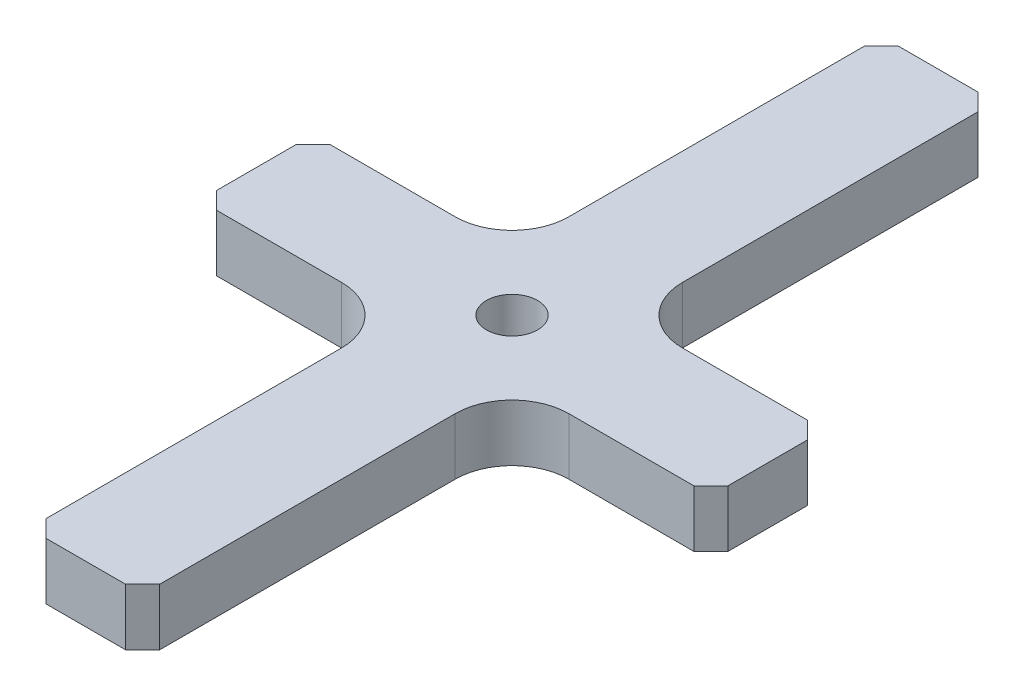
ISO-10303-21;
HEADER;
FILE_DESCRIPTION(('STEP AP214'),'2;1');
FILE_NAME('part.step','',(''),(''),'','','');
FILE_SCHEMA(('AUTOMOTIVE_DESIGN { 1 0 10303 214 1 1 1 1 }'));
ENDSEC;
DATA;
#1=APPLICATION_CONTEXT('core data for automotive mechanical design processes');
#2=APPLICATION_PROTOCOL_DEFINITION('international standard','automotive_design',2000,#1);
#3=PRODUCT_CONTEXT('',#1,'mechanical');
#4=PRODUCT('Part','Part','',(#3));
#5=PRODUCT_RELATED_PRODUCT_CATEGORY('part','',(#4));
#6=PRODUCT_DEFINITION_FORMATION('','',#4);
#7=PRODUCT_DEFINITION_CONTEXT('part definition',#1,'design');
#8=PRODUCT_DEFINITION('design','',#6,#7);
#9=PRODUCT_DEFINITION_SHAPE('','',#8);
#10=(LENGTH_UNIT() NAMED_UNIT(*) SI_UNIT(.MILLI.,.METRE.));
#11=(NAMED_UNIT(*) PLANE_ANGLE_UNIT() SI_UNIT($,.RADIAN.));
#12=(NAMED_UNIT(*) SI_UNIT($,.STERADIAN.) SOLID_ANGLE_UNIT());
#13=UNCERTAINTY_MEASURE_WITH_UNIT(LENGTH_MEASURE(1.E-05),#10,'distance_accuracy_value','');
#14=(GEOMETRIC_REPRESENTATION_CONTEXT(3) GLOBAL_UNCERTAINTY_ASSIGNED_CONTEXT((#13)) GLOBAL_UNIT_ASSIGNED_CONTEXT((#10,
#11,#12)) REPRESENTATION_CONTEXT('',''));
#15=CARTESIAN_POINT('',(0.,0.,0.));
#16=DIRECTION('',(0.,0.,1.));
#17=DIRECTION('',(1.,0.,0.));
#18=AXIS2_PLACEMENT_3D('',#15,#16,#17);
#19=CARTESIAN_POINT('',(22.5,2.5,-4.99999999999999));
#20=DIRECTION('',(0.,0.,1.));
#21=DIRECTION('',(1.,0.,0.));
#22=AXIS2_PLACEMENT_3D('',#19,#20,#21);
#23=PLANE('',#22);
#24=DIRECTION('',(-1.,0.,0.));
#25=VECTOR('',#24,1.);
#26=CARTESIAN_POINT('',(22.5,2.5,-4.99999999999999));
#27=LINE('',#26,#25);
#28=CARTESIAN_POINT('',(21.,2.5,-4.99999999999999));
#29=VERTEX_POINT('',#28);
#30=CARTESIAN_POINT('',(10.,2.5,-5.));
#31=VERTEX_POINT('',#30);
#32=EDGE_CURVE('E271',#29,#31,#27,.T.);
#33=ORIENTED_EDGE('',*,*,#32,.F.);
#34=DIRECTION('',(0.,-1.,0.));
#35=VECTOR('',#34,1.);
#36=CARTESIAN_POINT('',(21.,2.5,-4.99999999999999));
#37=LINE('',#36,#35);
#38=CARTESIAN_POINT('',(21.,-2.5,-4.99999999999999));
#39=VERTEX_POINT('',#38);
#40=EDGE_CURVE('E395',#29,#39,#37,.T.);
#41=ORIENTED_EDGE('',*,*,#40,.T.);
#42=DIRECTION('',(-1.,0.,0.));
#43=VECTOR('',#42,1.);
#44=CARTESIAN_POINT('',(22.5,-2.5,-4.99999999999999));
#45=LINE('',#44,#43);
#46=CARTESIAN_POINT('',(10.,-2.5,-5.));
#47=VERTEX_POINT('',#46);
#48=EDGE_CURVE('E458',#39,#47,#45,.T.);
#49=ORIENTED_EDGE('',*,*,#48,.T.);
#50=DIRECTION('',(0.,-1.,0.));
#51=VECTOR('',#50,1.);
#52=CARTESIAN_POINT('',(10.,2.5,-5.));
#53=LINE('',#52,#51);
#54=EDGE_CURVE('E279',#47,#31,#53,.F.);
#55=ORIENTED_EDGE('',*,*,#54,.T.);
#56=EDGE_LOOP('',(#33,#41,#49,#55));
#57=FACE_BOUND('',#56,.T.);
#58=ADVANCED_FACE('F45',(#57),#23,.F.);
#59=CARTESIAN_POINT('',(5.,2.5,-37.5));
#60=DIRECTION('',(-1.,0.,0.));
#61=DIRECTION('',(0.,0.,1.));
#62=AXIS2_PLACEMENT_3D('',#59,#60,#61);
#63=PLANE('',#62);
#64=DIRECTION('',(0.,0.,-1.));
#65=VECTOR('',#64,1.);
#66=CARTESIAN_POINT('',(5.,-2.5,-37.5));
#67=LINE('',#66,#65);
#68=CARTESIAN_POINT('',(5.,-2.5,-10.));
#69=VERTEX_POINT('',#68);
#70=CARTESIAN_POINT('',(5.,-2.5,-36.));
#71=VERTEX_POINT('',#70);
#72=EDGE_CURVE('E461',#69,#71,#67,.T.);
#73=ORIENTED_EDGE('',*,*,#72,.T.);
#74=DIRECTION('',(0.,1.,0.));
#75=VECTOR('',#74,1.);
#76=CARTESIAN_POINT('',(5.,2.5,-36.));
#77=LINE('',#76,#75);
#78=CARTESIAN_POINT('',(5.,2.5,-36.));
#79=VERTEX_POINT('',#78);
#80=EDGE_CURVE('E392',#71,#79,#77,.T.);
#81=ORIENTED_EDGE('',*,*,#80,.T.);
#82=DIRECTION('',(0.,0.,-1.));
#83=VECTOR('',#82,1.);
#84=CARTESIAN_POINT('',(5.,2.5,-37.5));
#85=LINE('',#84,#83);
#86=CARTESIAN_POINT('',(5.,2.5,-10.));
#87=VERTEX_POINT('',#86);
#88=EDGE_CURVE('E489',#87,#79,#85,.T.);
#89=ORIENTED_EDGE('',*,*,#88,.F.);
#90=DIRECTION('',(0.,-1.,0.));
#91=VECTOR('',#90,1.);
#92=CARTESIAN_POINT('',(5.,-2.5,-10.));
#93=LINE('',#92,#91);
#94=EDGE_CURVE('E275',#87,#69,#93,.T.);
#95=ORIENTED_EDGE('',*,*,#94,.T.);
#96=EDGE_LOOP('',(#73,#81,#89,#95));
#97=FACE_BOUND('',#96,.T.);
#98=ADVANCED_FACE('F536',(#97),#63,.F.);
#99=CARTESIAN_POINT('',(-5.,2.5,-37.5));
#100=DIRECTION('',(0.,0.,1.));
#101=DIRECTION('',(1.,0.,0.));
#102=AXIS2_PLACEMENT_3D('',#99,#100,#101);
#103=PLANE('',#102);
#104=DIRECTION('',(-1.,0.,0.));
#105=VECTOR('',#104,1.);
#106=CARTESIAN_POINT('',(-5.,-2.5,-37.5));
#107=LINE('',#106,#105);
#108=CARTESIAN_POINT('',(3.50000000000001,-2.5,-37.5));
#109=VERTEX_POINT('',#108);
#110=CARTESIAN_POINT('',(-3.49999999999998,-2.5,-37.5));
#111=VERTEX_POINT('',#110);
#112=EDGE_CURVE('E248',#109,#111,#107,.T.);
#113=ORIENTED_EDGE('',*,*,#112,.T.);
#114=DIRECTION('',(0.,1.,0.));
#115=VECTOR('',#114,1.);
#116=CARTESIAN_POINT('',(-3.49999999999998,2.5,-37.5));
#117=LINE('',#116,#115);
#118=CARTESIAN_POINT('',(-3.49999999999998,2.5,-37.5));
#119=VERTEX_POINT('',#118);
#120=EDGE_CURVE('E389',#111,#119,#117,.T.);
#121=ORIENTED_EDGE('',*,*,#120,.T.);
#122=DIRECTION('',(-1.,0.,0.));
#123=VECTOR('',#122,1.);
#124=CARTESIAN_POINT('',(-5.,2.5,-37.5));
#125=LINE('',#124,#123);
#126=CARTESIAN_POINT('',(3.50000000000001,2.5,-37.5));
#127=VERTEX_POINT('',#126);
#128=EDGE_CURVE('E480',#127,#119,#125,.T.);
#129=ORIENTED_EDGE('',*,*,#128,.F.);
#130=DIRECTION('',(0.,-1.,0.));
#131=VECTOR('',#130,1.);
#132=CARTESIAN_POINT('',(3.50000000000001,2.5,-37.5));
#133=LINE('',#132,#131);
#134=EDGE_CURVE('E385',#127,#109,#133,.T.);
#135=ORIENTED_EDGE('',*,*,#134,.T.);
#136=EDGE_LOOP('',(#113,#121,#129,#135));
#137=FACE_BOUND('',#136,.T.);
#138=ADVANCED_FACE('F470',(#137),#103,.F.);
#139=CARTESIAN_POINT('',(-5.,2.5,-37.5));
#140=DIRECTION('',(1.,0.,0.));
#141=DIRECTION('',(0.,0.,-1.));
#142=AXIS2_PLACEMENT_3D('',#139,#140,#141);
#143=PLANE('',#142);
#144=DIRECTION('',(0.,0.,1.));
#145=VECTOR('',#144,1.);
#146=CARTESIAN_POINT('',(-5.,2.5,-37.5));
#147=LINE('',#146,#145);
#148=CARTESIAN_POINT('',(-5.,2.5,-36.));
#149=VERTEX_POINT('',#148);
#150=CARTESIAN_POINT('',(-5.,2.5,-10.));
#151=VERTEX_POINT('',#150);
#152=EDGE_CURVE('E479',#149,#151,#147,.T.);
#153=ORIENTED_EDGE('',*,*,#152,.F.);
#154=DIRECTION('',(0.,-1.,0.));
#155=VECTOR('',#154,1.);
#156=CARTESIAN_POINT('',(-5.,2.5,-36.));
#157=LINE('',#156,#155);
#158=CARTESIAN_POINT('',(-5.,-2.5,-36.));
#159=VERTEX_POINT('',#158);
#160=EDGE_CURVE('E381',#149,#159,#157,.T.);
#161=ORIENTED_EDGE('',*,*,#160,.T.);
#162=DIRECTION('',(0.,0.,1.));
#163=VECTOR('',#162,1.);
#164=CARTESIAN_POINT('',(-5.,-2.5,-37.5));
#165=LINE('',#164,#163);
#166=CARTESIAN_POINT('',(-5.,-2.5,-10.));
#167=VERTEX_POINT('',#166);
#168=EDGE_CURVE('E241',#159,#167,#165,.T.);
#169=ORIENTED_EDGE('',*,*,#168,.T.);
#170=DIRECTION('',(0.,-1.,0.));
#171=VECTOR('',#170,1.);
#172=CARTESIAN_POINT('',(-5.,2.5,-10.));
#173=LINE('',#172,#171);
#174=EDGE_CURVE('E216',#167,#151,#173,.F.);
#175=ORIENTED_EDGE('',*,*,#174,.T.);
#176=EDGE_LOOP('',(#153,#161,#169,#175));
#177=FACE_BOUND('',#176,.T.);
#178=ADVANCED_FACE('F482',(#177),#143,.F.);
#179=CARTESIAN_POINT('',(-22.5,2.5,-4.99999999999999));
#180=DIRECTION('',(0.,0.,1.));
#181=DIRECTION('',(1.,0.,0.));
#182=AXIS2_PLACEMENT_3D('',#179,#180,#181);
#183=PLANE('',#182);
#184=DIRECTION('',(-1.,0.,0.));
#185=VECTOR('',#184,1.);
#186=CARTESIAN_POINT('',(-22.5,-2.5,-4.99999999999999));
#187=LINE('',#186,#185);
#188=CARTESIAN_POINT('',(-10.,-2.5,-5.));
#189=VERTEX_POINT('',#188);
#190=CARTESIAN_POINT('',(-21.,-2.5,-4.99999999999999));
#191=VERTEX_POINT('',#190);
#192=EDGE_CURVE('E228',#189,#191,#187,.T.);
#193=ORIENTED_EDGE('',*,*,#192,.T.);
#194=DIRECTION('',(0.,1.,0.));
#195=VECTOR('',#194,1.);
#196=CARTESIAN_POINT('',(-21.,2.5,-4.99999999999999));
#197=LINE('',#196,#195);
#198=CARTESIAN_POINT('',(-21.,2.5,-4.99999999999999));
#199=VERTEX_POINT('',#198);
#200=EDGE_CURVE('E378',#191,#199,#197,.T.);
#201=ORIENTED_EDGE('',*,*,#200,.T.);
#202=DIRECTION('',(-1.,0.,0.));
#203=VECTOR('',#202,1.);
#204=CARTESIAN_POINT('',(-22.5,2.5,-4.99999999999999));
#205=LINE('',#204,#203);
#206=CARTESIAN_POINT('',(-10.,2.5,-5.));
#207=VERTEX_POINT('',#206);
#208=EDGE_CURVE('E231',#207,#199,#205,.T.);
#209=ORIENTED_EDGE('',*,*,#208,.F.);
#210=DIRECTION('',(0.,-1.,0.));
#211=VECTOR('',#210,1.);
#212=CARTESIAN_POINT('',(-10.,-2.5,-5.));
#213=LINE('',#212,#211);
#214=EDGE_CURVE('E214',#207,#189,#213,.T.);
#215=ORIENTED_EDGE('',*,*,#214,.T.);
#216=EDGE_LOOP('',(#193,#201,#209,#215));
#217=FACE_BOUND('',#216,.T.);
#218=ADVANCED_FACE('F227',(#217),#183,.F.);
#219=CARTESIAN_POINT('',(-22.5,2.5,4.99999999999999));
#220=DIRECTION('',(1.,0.,0.));
#221=DIRECTION('',(0.,0.,-1.));
#222=AXIS2_PLACEMENT_3D('',#219,#220,#221);
#223=PLANE('',#222);
#224=DIRECTION('',(0.,0.,1.));
#225=VECTOR('',#224,1.);
#226=CARTESIAN_POINT('',(-22.5,-2.5,4.99999999999999));
#227=LINE('',#226,#225);
#228=CARTESIAN_POINT('',(-22.5,-2.5,-3.50000000000003));
#229=VERTEX_POINT('',#228);
#230=CARTESIAN_POINT('',(-22.5,-2.5,3.49999999999999));
#231=VERTEX_POINT('',#230);
#232=EDGE_CURVE('E240',#229,#231,#227,.T.);
#233=ORIENTED_EDGE('',*,*,#232,.T.);
#234=DIRECTION('',(0.,1.,0.));
#235=VECTOR('',#234,1.);
#236=CARTESIAN_POINT('',(-22.5,2.5,3.49999999999999));
#237=LINE('',#236,#235);
#238=CARTESIAN_POINT('',(-22.5,2.5,3.49999999999999));
#239=VERTEX_POINT('',#238);
#240=EDGE_CURVE('E352',#231,#239,#237,.T.);
#241=ORIENTED_EDGE('',*,*,#240,.T.);
#242=DIRECTION('',(0.,0.,1.));
#243=VECTOR('',#242,1.);
#244=CARTESIAN_POINT('',(-22.5,2.5,4.99999999999999));
#245=LINE('',#244,#243);
#246=CARTESIAN_POINT('',(-22.5,2.5,-3.50000000000003));
#247=VERTEX_POINT('',#246);
#248=EDGE_CURVE('E487',#247,#239,#245,.T.);
#249=ORIENTED_EDGE('',*,*,#248,.F.);
#250=DIRECTION('',(0.,-1.,0.));
#251=VECTOR('',#250,1.);
#252=CARTESIAN_POINT('',(-22.5,2.5,-3.50000000000003));
#253=LINE('',#252,#251);
#254=EDGE_CURVE('E348',#247,#229,#253,.T.);
#255=ORIENTED_EDGE('',*,*,#254,.T.);
#256=EDGE_LOOP('',(#233,#241,#249,#255));
#257=FACE_BOUND('',#256,.T.);
#258=ADVANCED_FACE('F520',(#257),#223,.F.);
#259=CARTESIAN_POINT('',(-22.5,2.5,4.99999999999999));
#260=DIRECTION('',(0.,0.,-1.));
#261=DIRECTION('',(-1.,0.,0.));
#262=AXIS2_PLACEMENT_3D('',#259,#260,#261);
#263=PLANE('',#262);
#264=DIRECTION('',(1.,0.,0.));
#265=VECTOR('',#264,1.);
#266=CARTESIAN_POINT('',(-22.5,2.5,4.99999999999999));
#267=LINE('',#266,#265);
#268=CARTESIAN_POINT('',(-21.,2.5,4.99999999999999));
#269=VERTEX_POINT('',#268);
#270=CARTESIAN_POINT('',(-10.,2.5,5.));
#271=VERTEX_POINT('',#270);
#272=EDGE_CURVE('E495',#269,#271,#267,.T.);
#273=ORIENTED_EDGE('',*,*,#272,.F.);
#274=DIRECTION('',(0.,-1.,0.));
#275=VECTOR('',#274,1.);
#276=CARTESIAN_POINT('',(-21.,2.5,4.99999999999999));
#277=LINE('',#276,#275);
#278=CARTESIAN_POINT('',(-21.,-2.5,4.99999999999999));
#279=VERTEX_POINT('',#278);
#280=EDGE_CURVE('E321',#269,#279,#277,.T.);
#281=ORIENTED_EDGE('',*,*,#280,.T.);
#282=DIRECTION('',(1.,0.,0.));
#283=VECTOR('',#282,1.);
#284=CARTESIAN_POINT('',(-22.5,-2.5,4.99999999999999));
#285=LINE('',#284,#283);
#286=CARTESIAN_POINT('',(-10.,-2.5,5.));
#287=VERTEX_POINT('',#286);
#288=EDGE_CURVE('E246',#279,#287,#285,.T.);
#289=ORIENTED_EDGE('',*,*,#288,.T.);
#290=DIRECTION('',(0.,-1.,0.));
#291=VECTOR('',#290,1.);
#292=CARTESIAN_POINT('',(-10.,2.5,5.));
#293=LINE('',#292,#291);
#294=EDGE_CURVE('E222',#287,#271,#293,.F.);
#295=ORIENTED_EDGE('',*,*,#294,.T.);
#296=EDGE_LOOP('',(#273,#281,#289,#295));
#297=FACE_BOUND('',#296,.T.);
#298=ADVANCED_FACE('F512',(#297),#263,.F.);
#299=CARTESIAN_POINT('',(-5.00000000000001,2.5,37.5));
#300=DIRECTION('',(1.,0.,0.));
#301=DIRECTION('',(0.,0.,-1.));
#302=AXIS2_PLACEMENT_3D('',#299,#300,#301);
#303=PLANE('',#302);
#304=DIRECTION('',(0.,0.,1.));
#305=VECTOR('',#304,1.);
#306=CARTESIAN_POINT('',(-5.00000000000001,-2.5,37.5));
#307=LINE('',#306,#305);
#308=CARTESIAN_POINT('',(-5.,-2.5,9.99999999999999));
#309=VERTEX_POINT('',#308);
#310=CARTESIAN_POINT('',(-5.00000000000001,-2.5,36.));
#311=VERTEX_POINT('',#310);
#312=EDGE_CURVE('E254',#309,#311,#307,.T.);
#313=ORIENTED_EDGE('',*,*,#312,.T.);
#314=DIRECTION('',(0.,1.,0.));
#315=VECTOR('',#314,1.);
#316=CARTESIAN_POINT('',(-5.00000000000001,2.5,36.));
#317=LINE('',#316,#315);
#318=CARTESIAN_POINT('',(-5.00000000000001,2.5,36.));
#319=VERTEX_POINT('',#318);
#320=EDGE_CURVE('E11',#311,#319,#317,.T.);
#321=ORIENTED_EDGE('',*,*,#320,.T.);
#322=DIRECTION('',(0.,0.,1.));
#323=VECTOR('',#322,1.);
#324=CARTESIAN_POINT('',(-5.00000000000001,2.5,37.5));
#325=LINE('',#324,#323);
#326=CARTESIAN_POINT('',(-5.,2.5,9.99999999999999));
#327=VERTEX_POINT('',#326);
#328=EDGE_CURVE('E433',#327,#319,#325,.T.);
#329=ORIENTED_EDGE('',*,*,#328,.F.);
#330=DIRECTION('',(0.,-1.,0.));
#331=VECTOR('',#330,1.);
#332=CARTESIAN_POINT('',(-5.,-2.5,10.));
#333=LINE('',#332,#331);
#334=EDGE_CURVE('E291',#327,#309,#333,.T.);
#335=ORIENTED_EDGE('',*,*,#334,.T.);
#336=EDGE_LOOP('',(#313,#321,#329,#335));
#337=FACE_BOUND('',#336,.T.);
#338=ADVANCED_FACE('F506',(#337),#303,.F.);
#339=CARTESIAN_POINT('',(-5.00000000000001,2.5,37.5));
#340=DIRECTION('',(0.,0.,-1.));
#341=DIRECTION('',(-1.,0.,0.));
#342=AXIS2_PLACEMENT_3D('',#339,#340,#341);
#343=PLANE('',#342);
#344=DIRECTION('',(1.,0.,0.));
#345=VECTOR('',#344,1.);
#346=CARTESIAN_POINT('',(-5.00000000000001,-2.5,37.5));
#347=LINE('',#346,#345);
#348=CARTESIAN_POINT('',(-3.50000000000002,-2.5,37.5));
#349=VERTEX_POINT('',#348);
#350=CARTESIAN_POINT('',(3.50000000000001,-2.5,37.5));
#351=VERTEX_POINT('',#350);
#352=EDGE_CURVE('E258',#349,#351,#347,.T.);
#353=ORIENTED_EDGE('',*,*,#352,.T.);
#354=DIRECTION('',(0.,1.,0.));
#355=VECTOR('',#354,1.);
#356=CARTESIAN_POINT('',(3.50000000000001,2.5,37.5));
#357=LINE('',#356,#355);
#358=CARTESIAN_POINT('',(3.50000000000001,2.5,37.5));
#359=VERTEX_POINT('',#358);
#360=EDGE_CURVE('E55',#351,#359,#357,.T.);
#361=ORIENTED_EDGE('',*,*,#360,.T.);
#362=DIRECTION('',(1.,0.,0.));
#363=VECTOR('',#362,1.);
#364=CARTESIAN_POINT('',(-5.00000000000001,2.5,37.5));
#365=LINE('',#364,#363);
#366=CARTESIAN_POINT('',(-3.50000000000002,2.5,37.5));
#367=VERTEX_POINT('',#366);
#368=EDGE_CURVE('E421',#367,#359,#365,.T.);
#369=ORIENTED_EDGE('',*,*,#368,.F.);
#370=DIRECTION('',(0.,-1.,0.));
#371=VECTOR('',#370,1.);
#372=CARTESIAN_POINT('',(-3.50000000000002,2.5,37.5));
#373=LINE('',#372,#371);
#374=EDGE_CURVE('E412',#367,#349,#373,.T.);
#375=ORIENTED_EDGE('',*,*,#374,.T.);
#376=EDGE_LOOP('',(#353,#361,#369,#375));
#377=FACE_BOUND('',#376,.T.);
#378=ADVANCED_FACE('F420',(#377),#343,.F.);
#379=CARTESIAN_POINT('',(5.00000000000001,2.5,37.5));
#380=DIRECTION('',(-1.,0.,0.));
#381=DIRECTION('',(0.,0.,1.));
#382=AXIS2_PLACEMENT_3D('',#379,#380,#381);
#383=PLANE('',#382);
#384=DIRECTION('',(0.,0.,-1.));
#385=VECTOR('',#384,1.);
#386=CARTESIAN_POINT('',(5.00000000000001,2.5,37.5));
#387=LINE('',#386,#385);
#388=CARTESIAN_POINT('',(5.00000000000001,2.5,36.));
#389=VERTEX_POINT('',#388);
#390=CARTESIAN_POINT('',(5.,2.5,9.99999999999999));
#391=VERTEX_POINT('',#390);
#392=EDGE_CURVE('E432',#389,#391,#387,.T.);
#393=ORIENTED_EDGE('',*,*,#392,.F.);
#394=DIRECTION('',(0.,-1.,0.));
#395=VECTOR('',#394,1.);
#396=CARTESIAN_POINT('',(5.00000000000001,2.5,36.));
#397=LINE('',#396,#395);
#398=CARTESIAN_POINT('',(5.00000000000001,-2.5,36.));
#399=VERTEX_POINT('',#398);
#400=EDGE_CURVE('E408',#389,#399,#397,.T.);
#401=ORIENTED_EDGE('',*,*,#400,.T.);
#402=DIRECTION('',(0.,0.,-1.));
#403=VECTOR('',#402,1.);
#404=CARTESIAN_POINT('',(5.00000000000001,-2.5,37.5));
#405=LINE('',#404,#403);
#406=CARTESIAN_POINT('',(5.,-2.5,9.99999999999999));
#407=VERTEX_POINT('',#406);
#408=EDGE_CURVE('E262',#399,#407,#405,.T.);
#409=ORIENTED_EDGE('',*,*,#408,.T.);
#410=DIRECTION('',(0.,-1.,0.));
#411=VECTOR('',#410,1.);
#412=CARTESIAN_POINT('',(5.,2.5,10.));
#413=LINE('',#412,#411);
#414=EDGE_CURVE('E287',#407,#391,#413,.F.);
#415=ORIENTED_EDGE('',*,*,#414,.T.);
#416=EDGE_LOOP('',(#393,#401,#409,#415));
#417=FACE_BOUND('',#416,.T.);
#418=ADVANCED_FACE('F439',(#417),#383,.F.);
#419=CARTESIAN_POINT('',(22.5,2.5,4.99999999999999));
#420=DIRECTION('',(0.,0.,-1.));
#421=DIRECTION('',(-1.,0.,0.));
#422=AXIS2_PLACEMENT_3D('',#419,#420,#421);
#423=PLANE('',#422);
#424=DIRECTION('',(1.,0.,0.));
#425=VECTOR('',#424,1.);
#426=CARTESIAN_POINT('',(22.5,-2.5,4.99999999999999));
#427=LINE('',#426,#425);
#428=CARTESIAN_POINT('',(10.,-2.5,5.));
#429=VERTEX_POINT('',#428);
#430=CARTESIAN_POINT('',(21.,-2.5,4.99999999999999));
#431=VERTEX_POINT('',#430);
#432=EDGE_CURVE('E265',#429,#431,#427,.T.);
#433=ORIENTED_EDGE('',*,*,#432,.T.);
#434=DIRECTION('',(0.,1.,0.));
#435=VECTOR('',#434,1.);
#436=CARTESIAN_POINT('',(21.,2.5,4.99999999999999));
#437=LINE('',#436,#435);
#438=CARTESIAN_POINT('',(21.,2.5,4.99999999999999));
#439=VERTEX_POINT('',#438);
#440=EDGE_CURVE('E405',#431,#439,#437,.T.);
#441=ORIENTED_EDGE('',*,*,#440,.T.);
#442=DIRECTION('',(1.,0.,0.));
#443=VECTOR('',#442,1.);
#444=CARTESIAN_POINT('',(22.5,2.5,4.99999999999999));
#445=LINE('',#444,#443);
#446=CARTESIAN_POINT('',(10.,2.5,5.));
#447=VERTEX_POINT('',#446);
#448=EDGE_CURVE('E447',#447,#439,#445,.T.);
#449=ORIENTED_EDGE('',*,*,#448,.F.);
#450=DIRECTION('',(0.,-1.,0.));
#451=VECTOR('',#450,1.);
#452=CARTESIAN_POINT('',(10.,-2.5,5.));
#453=LINE('',#452,#451);
#454=EDGE_CURVE('E283',#447,#429,#453,.T.);
#455=ORIENTED_EDGE('',*,*,#454,.T.);
#456=EDGE_LOOP('',(#433,#441,#449,#455));
#457=FACE_BOUND('',#456,.T.);
#458=ADVANCED_FACE('F449',(#457),#423,.F.);
#459=CARTESIAN_POINT('',(22.5,2.5,4.99999999999999));
#460=DIRECTION('',(-1.,0.,0.));
#461=DIRECTION('',(0.,0.,1.));
#462=AXIS2_PLACEMENT_3D('',#459,#460,#461);
#463=PLANE('',#462);
#464=DIRECTION('',(0.,0.,-1.));
#465=VECTOR('',#464,1.);
#466=CARTESIAN_POINT('',(22.5,-2.5,4.99999999999999));
#467=LINE('',#466,#465);
#468=CARTESIAN_POINT('',(22.5,-2.5,3.49999999999997));
#469=VERTEX_POINT('',#468);
#470=CARTESIAN_POINT('',(22.5,-2.5,-3.49999999999997));
#471=VERTEX_POINT('',#470);
#472=EDGE_CURVE('E269',#469,#471,#467,.T.);
#473=ORIENTED_EDGE('',*,*,#472,.T.);
#474=DIRECTION('',(0.,1.,0.));
#475=VECTOR('',#474,1.);
#476=CARTESIAN_POINT('',(22.5,2.5,-3.49999999999997));
#477=LINE('',#476,#475);
#478=CARTESIAN_POINT('',(22.5,2.5,-3.49999999999997));
#479=VERTEX_POINT('',#478);
#480=EDGE_CURVE('E62',#471,#479,#477,.T.);
#481=ORIENTED_EDGE('',*,*,#480,.T.);
#482=DIRECTION('',(0.,0.,-1.));
#483=VECTOR('',#482,1.);
#484=CARTESIAN_POINT('',(22.5,2.5,4.99999999999999));
#485=LINE('',#484,#483);
#486=CARTESIAN_POINT('',(22.5,2.5,3.49999999999997));
#487=VERTEX_POINT('',#486);
#488=EDGE_CURVE('E233',#487,#479,#485,.T.);
#489=ORIENTED_EDGE('',*,*,#488,.F.);
#490=DIRECTION('',(0.,-1.,0.));
#491=VECTOR('',#490,1.);
#492=CARTESIAN_POINT('',(22.5,2.5,3.49999999999997));
#493=LINE('',#492,#491);
#494=EDGE_CURVE('E399',#487,#469,#493,.T.);
#495=ORIENTED_EDGE('',*,*,#494,.T.);
#496=EDGE_LOOP('',(#473,#481,#489,#495));
#497=FACE_BOUND('',#496,.T.);
#498=ADVANCED_FACE('F596',(#497),#463,.F.);
#499=CARTESIAN_POINT('',(0.,2.5,0.));
#500=DIRECTION('',(0.,1.,0.));
#501=DIRECTION('',(0.,0.,1.));
#502=AXIS2_PLACEMENT_3D('',#499,#500,#501);
#503=PLANE('',#502);
#504=CARTESIAN_POINT('',(0.,2.5,0.));
#505=DIRECTION('',(0.,1.,0.));
#506=DIRECTION('',(0.,0.,1.));
#507=AXIS2_PLACEMENT_3D('',#504,#505,#506);
#508=CIRCLE('',#507,2.24999999999999);
#509=CARTESIAN_POINT('',(0.,2.5,2.24999999999999));
#510=VERTEX_POINT('',#509);
#511=EDGE_CURVE('E610',#510,#510,#508,.T.);
#512=ORIENTED_EDGE('',*,*,#511,.F.);
#513=EDGE_LOOP('',(#512));
#514=FACE_BOUND('',#513,.T.);
#515=ORIENTED_EDGE('',*,*,#248,.T.);
#516=DIRECTION('',(-0.707106781186546,0.,-0.707106781186549));
#517=VECTOR('',#516,1.);
#518=CARTESIAN_POINT('',(-13.,2.5,13.));
#519=LINE('',#518,#517);
#520=EDGE_CURVE('E375',#239,#269,#519,.F.);
#521=ORIENTED_EDGE('',*,*,#520,.T.);
#522=ORIENTED_EDGE('',*,*,#272,.T.);
#523=CARTESIAN_POINT('',(-10.,2.5,9.99999999999999));
#524=DIRECTION('',(0.,1.,0.));
#525=DIRECTION('',(0.,0.,1.));
#526=AXIS2_PLACEMENT_3D('',#523,#524,#525);
#527=CIRCLE('',#526,5.);
#528=EDGE_CURVE('E318',#271,#327,#527,.F.);
#529=ORIENTED_EDGE('',*,*,#528,.T.);
#530=ORIENTED_EDGE('',*,*,#328,.T.);
#531=DIRECTION('',(-0.707106781186544,0.,-0.707106781186551));
#532=VECTOR('',#531,1.);
#533=CARTESIAN_POINT('',(-20.5,2.5,20.4999999999998));
#534=LINE('',#533,#532);
#535=EDGE_CURVE('E355',#319,#367,#534,.F.);
#536=ORIENTED_EDGE('',*,*,#535,.T.);
#537=ORIENTED_EDGE('',*,*,#368,.T.);
#538=DIRECTION('',(-0.707106781186549,0.,0.707106781186546));
#539=VECTOR('',#538,1.);
#540=CARTESIAN_POINT('',(20.5,2.5,20.5000000000001));
#541=LINE('',#540,#539);
#542=EDGE_CURVE('E358',#359,#389,#541,.F.);
#543=ORIENTED_EDGE('',*,*,#542,.T.);
#544=ORIENTED_EDGE('',*,*,#392,.T.);
#545=CARTESIAN_POINT('',(10.,2.5,9.99999999999999));
#546=DIRECTION('',(0.,1.,0.));
#547=DIRECTION('',(0.,0.,1.));
#548=AXIS2_PLACEMENT_3D('',#545,#546,#547);
#549=CIRCLE('',#548,5.);
#550=EDGE_CURVE('E311',#391,#447,#549,.F.);
#551=ORIENTED_EDGE('',*,*,#550,.T.);
#552=ORIENTED_EDGE('',*,*,#448,.T.);
#553=DIRECTION('',(-0.707106781186549,0.,0.707106781186546));
#554=VECTOR('',#553,1.);
#555=CARTESIAN_POINT('',(12.9999999999999,2.5,13.));
#556=LINE('',#555,#554);
#557=EDGE_CURVE('E69',#439,#487,#556,.F.);
#558=ORIENTED_EDGE('',*,*,#557,.T.);
#559=ORIENTED_EDGE('',*,*,#488,.T.);
#560=DIRECTION('',(0.707106781186546,0.,0.707106781186549));
#561=VECTOR('',#560,1.);
#562=CARTESIAN_POINT('',(13.,2.5,-13.));
#563=LINE('',#562,#561);
#564=EDGE_CURVE('E363',#479,#29,#563,.F.);
#565=ORIENTED_EDGE('',*,*,#564,.T.);
#566=ORIENTED_EDGE('',*,*,#32,.T.);
#567=CARTESIAN_POINT('',(10.,2.5,-10.));
#568=DIRECTION('',(0.,1.,0.));
#569=DIRECTION('',(0.,0.,1.));
#570=AXIS2_PLACEMENT_3D('',#567,#568,#569);
#571=CIRCLE('',#570,5.);
#572=EDGE_CURVE('E304',#31,#87,#571,.F.);
#573=ORIENTED_EDGE('',*,*,#572,.T.);
#574=ORIENTED_EDGE('',*,*,#88,.T.);
#575=DIRECTION('',(0.707106781186544,0.,0.707106781186551));
#576=VECTOR('',#575,1.);
#577=CARTESIAN_POINT('',(20.5,2.5,-20.4999999999998));
#578=LINE('',#577,#576);
#579=EDGE_CURVE('E366',#79,#127,#578,.F.);
#580=ORIENTED_EDGE('',*,*,#579,.T.);
#581=ORIENTED_EDGE('',*,*,#128,.T.);
#582=DIRECTION('',(0.707106781186549,0.,-0.707106781186546));
#583=VECTOR('',#582,1.);
#584=CARTESIAN_POINT('',(-20.5,2.5,-20.5000000000001));
#585=LINE('',#584,#583);
#586=EDGE_CURVE('E369',#119,#149,#585,.F.);
#587=ORIENTED_EDGE('',*,*,#586,.T.);
#588=ORIENTED_EDGE('',*,*,#152,.T.);
#589=CARTESIAN_POINT('',(-10.,2.5,-10.));
#590=DIRECTION('',(0.,1.,0.));
#591=DIRECTION('',(0.,0.,1.));
#592=AXIS2_PLACEMENT_3D('',#589,#590,#591);
#593=CIRCLE('',#592,5.);
#594=EDGE_CURVE('E221',#151,#207,#593,.F.);
#595=ORIENTED_EDGE('',*,*,#594,.T.);
#596=ORIENTED_EDGE('',*,*,#208,.T.);
#597=DIRECTION('',(0.707106781186549,0.,-0.707106781186546));
#598=VECTOR('',#597,1.);
#599=CARTESIAN_POINT('',(-13.,2.5,-13.));
#600=LINE('',#599,#598);
#601=EDGE_CURVE('E372',#199,#247,#600,.F.);
#602=ORIENTED_EDGE('',*,*,#601,.T.);
#603=EDGE_LOOP('',(#515,#521,#522,#529,#530,#536,#537,#543,#544,#551,#552,#558,#559,#565,#566,
#573,#574,#580,#581,#587,#588,#595,#596,#602));
#604=FACE_BOUND('',#603,.T.);
#605=ADVANCED_FACE('F427',(#514,#604),#503,.T.);
#606=CARTESIAN_POINT('',(0.,-2.5,0.));
#607=DIRECTION('',(0.,1.,0.));
#608=DIRECTION('',(0.,0.,1.));
#609=AXIS2_PLACEMENT_3D('',#606,#607,#608);
#610=PLANE('',#609);
#611=CARTESIAN_POINT('',(0.,-2.5,0.));
#612=DIRECTION('',(0.,1.,0.));
#613=DIRECTION('',(0.,0.,1.));
#614=AXIS2_PLACEMENT_3D('',#611,#612,#613);
#615=CIRCLE('',#614,2.24999999999999);
#616=CARTESIAN_POINT('',(0.,-2.5,2.24999999999999));
#617=VERTEX_POINT('',#616);
#618=EDGE_CURVE('E462',#617,#617,#615,.T.);
#619=ORIENTED_EDGE('',*,*,#618,.T.);
#620=EDGE_LOOP('',(#619));
#621=FACE_BOUND('',#620,.T.);
#622=ORIENTED_EDGE('',*,*,#288,.F.);
#623=DIRECTION('',(0.707106781186546,0.,0.707106781186549));
#624=VECTOR('',#623,1.);
#625=CARTESIAN_POINT('',(-21.,-2.5,4.99999999999999));
#626=LINE('',#625,#624);
#627=EDGE_CURVE('E345',#279,#231,#626,.F.);
#628=ORIENTED_EDGE('',*,*,#627,.T.);
#629=ORIENTED_EDGE('',*,*,#232,.F.);
#630=DIRECTION('',(-0.707106781186549,0.,0.707106781186546));
#631=VECTOR('',#630,1.);
#632=CARTESIAN_POINT('',(-22.5,-2.5,-3.50000000000003));
#633=LINE('',#632,#631);
#634=EDGE_CURVE('E238',#229,#191,#633,.F.);
#635=ORIENTED_EDGE('',*,*,#634,.T.);
#636=ORIENTED_EDGE('',*,*,#192,.F.);
#637=CARTESIAN_POINT('',(-10.,-2.5,-10.));
#638=DIRECTION('',(0.,1.,0.));
#639=DIRECTION('',(0.,0.,1.));
#640=AXIS2_PLACEMENT_3D('',#637,#638,#639);
#641=CIRCLE('',#640,5.);
#642=EDGE_CURVE('E210',#189,#167,#641,.T.);
#643=ORIENTED_EDGE('',*,*,#642,.T.);
#644=ORIENTED_EDGE('',*,*,#168,.F.);
#645=DIRECTION('',(-0.707106781186549,0.,0.707106781186546));
#646=VECTOR('',#645,1.);
#647=CARTESIAN_POINT('',(-5.,-2.5,-36.));
#648=LINE('',#647,#646);
#649=EDGE_CURVE('E340',#159,#111,#648,.F.);
#650=ORIENTED_EDGE('',*,*,#649,.T.);
#651=ORIENTED_EDGE('',*,*,#112,.F.);
#652=DIRECTION('',(-0.707106781186544,0.,-0.707106781186551));
#653=VECTOR('',#652,1.);
#654=CARTESIAN_POINT('',(3.50000000000001,-2.5,-37.5));
#655=LINE('',#654,#653);
#656=EDGE_CURVE('E337',#109,#71,#655,.F.);
#657=ORIENTED_EDGE('',*,*,#656,.T.);
#658=ORIENTED_EDGE('',*,*,#72,.F.);
#659=CARTESIAN_POINT('',(10.,-2.5,-10.));
#660=DIRECTION('',(0.,1.,0.));
#661=DIRECTION('',(0.,0.,1.));
#662=AXIS2_PLACEMENT_3D('',#659,#660,#661);
#663=CIRCLE('',#662,5.);
#664=EDGE_CURVE('E300',#69,#47,#663,.T.);
#665=ORIENTED_EDGE('',*,*,#664,.T.);
#666=ORIENTED_EDGE('',*,*,#48,.F.);
#667=DIRECTION('',(-0.707106781186546,0.,-0.707106781186549));
#668=VECTOR('',#667,1.);
#669=CARTESIAN_POINT('',(21.,-2.5,-4.99999999999999));
#670=LINE('',#669,#668);
#671=EDGE_CURVE('E334',#39,#471,#670,.F.);
#672=ORIENTED_EDGE('',*,*,#671,.T.);
#673=ORIENTED_EDGE('',*,*,#472,.F.);
#674=DIRECTION('',(0.707106781186549,0.,-0.707106781186546));
#675=VECTOR('',#674,1.);
#676=CARTESIAN_POINT('',(22.5,-2.5,3.49999999999997));
#677=LINE('',#676,#675);
#678=EDGE_CURVE('E331',#469,#431,#677,.F.);
#679=ORIENTED_EDGE('',*,*,#678,.T.);
#680=ORIENTED_EDGE('',*,*,#432,.F.);
#681=CARTESIAN_POINT('',(10.,-2.5,9.99999999999999));
#682=DIRECTION('',(0.,1.,0.));
#683=DIRECTION('',(0.,0.,1.));
#684=AXIS2_PLACEMENT_3D('',#681,#682,#683);
#685=CIRCLE('',#684,5.);
#686=EDGE_CURVE('E307',#429,#407,#685,.T.);
#687=ORIENTED_EDGE('',*,*,#686,.T.);
#688=ORIENTED_EDGE('',*,*,#408,.F.);
#689=DIRECTION('',(0.707106781186549,0.,-0.707106781186546));
#690=VECTOR('',#689,1.);
#691=CARTESIAN_POINT('',(5.00000000000001,-2.5,36.));
#692=LINE('',#691,#690);
#693=EDGE_CURVE('E328',#399,#351,#692,.F.);
#694=ORIENTED_EDGE('',*,*,#693,.T.);
#695=ORIENTED_EDGE('',*,*,#352,.F.);
#696=DIRECTION('',(0.707106781186544,0.,0.707106781186551));
#697=VECTOR('',#696,1.);
#698=CARTESIAN_POINT('',(-3.50000000000002,-2.5,37.5));
#699=LINE('',#698,#697);
#700=EDGE_CURVE('E325',#349,#311,#699,.F.);
#701=ORIENTED_EDGE('',*,*,#700,.T.);
#702=ORIENTED_EDGE('',*,*,#312,.F.);
#703=CARTESIAN_POINT('',(-10.,-2.5,9.99999999999999));
#704=DIRECTION('',(0.,1.,0.));
#705=DIRECTION('',(0.,0.,1.));
#706=AXIS2_PLACEMENT_3D('',#703,#704,#705);
#707=CIRCLE('',#706,5.);
#708=EDGE_CURVE('E314',#309,#287,#707,.T.);
#709=ORIENTED_EDGE('',*,*,#708,.T.);
#710=EDGE_LOOP('',(#622,#628,#629,#635,#636,#643,#644,#650,#651,#657,#658,#665,#666,#672,#673,
#679,#680,#687,#688,#694,#695,#701,#702,#709));
#711=FACE_BOUND('',#710,.T.);
#712=ADVANCED_FACE('F236',(#621,#711),#610,.F.);
#713=CARTESIAN_POINT('',(-10.,2.5,-10.));
#714=DIRECTION('',(0.,1.,0.));
#715=DIRECTION('',(0.,0.,1.));
#716=AXIS2_PLACEMENT_3D('',#713,#714,#715);
#717=CYLINDRICAL_SURFACE('',#716,5.);
#718=ORIENTED_EDGE('',*,*,#594,.F.);
#719=ORIENTED_EDGE('',*,*,#174,.F.);
#720=ORIENTED_EDGE('',*,*,#642,.F.);
#721=ORIENTED_EDGE('',*,*,#214,.F.);
#722=EDGE_LOOP('',(#718,#719,#720,#721));
#723=FACE_BOUND('',#722,.T.);
#724=ADVANCED_FACE('F213',(#723),#717,.F.);
#725=CARTESIAN_POINT('',(10.,2.5,-10.));
#726=DIRECTION('',(0.,1.,0.));
#727=DIRECTION('',(0.,0.,1.));
#728=AXIS2_PLACEMENT_3D('',#725,#726,#727);
#729=CYLINDRICAL_SURFACE('',#728,5.);
#730=ORIENTED_EDGE('',*,*,#572,.F.);
#731=ORIENTED_EDGE('',*,*,#54,.F.);
#732=ORIENTED_EDGE('',*,*,#664,.F.);
#733=ORIENTED_EDGE('',*,*,#94,.F.);
#734=EDGE_LOOP('',(#730,#731,#732,#733));
#735=FACE_BOUND('',#734,.T.);
#736=ADVANCED_FACE('F549',(#735),#729,.F.);
#737=CARTESIAN_POINT('',(10.,2.5,9.99999999999999));
#738=DIRECTION('',(0.,1.,0.));
#739=DIRECTION('',(0.,0.,1.));
#740=AXIS2_PLACEMENT_3D('',#737,#738,#739);
#741=CYLINDRICAL_SURFACE('',#740,5.);
#742=ORIENTED_EDGE('',*,*,#550,.F.);
#743=ORIENTED_EDGE('',*,*,#414,.F.);
#744=ORIENTED_EDGE('',*,*,#686,.F.);
#745=ORIENTED_EDGE('',*,*,#454,.F.);
#746=EDGE_LOOP('',(#742,#743,#744,#745));
#747=FACE_BOUND('',#746,.T.);
#748=ADVANCED_FACE('F445',(#747),#741,.F.);
#749=CARTESIAN_POINT('',(-10.,2.5,9.99999999999999));
#750=DIRECTION('',(0.,1.,0.));
#751=DIRECTION('',(0.,0.,1.));
#752=AXIS2_PLACEMENT_3D('',#749,#750,#751);
#753=CYLINDRICAL_SURFACE('',#752,5.);
#754=ORIENTED_EDGE('',*,*,#528,.F.);
#755=ORIENTED_EDGE('',*,*,#294,.F.);
#756=ORIENTED_EDGE('',*,*,#708,.F.);
#757=ORIENTED_EDGE('',*,*,#334,.F.);
#758=EDGE_LOOP('',(#754,#755,#756,#757));
#759=FACE_BOUND('',#758,.T.);
#760=ADVANCED_FACE('F508',(#759),#753,.F.);
#761=CARTESIAN_POINT('',(-21.,2.5,4.99999999999999));
#762=DIRECTION('',(0.707106781186549,0.,-0.707106781186546));
#763=DIRECTION('',(0.,-1.,0.));
#764=AXIS2_PLACEMENT_3D('',#761,#762,#763);
#765=PLANE('',#764);
#766=ORIENTED_EDGE('',*,*,#520,.F.);
#767=ORIENTED_EDGE('',*,*,#240,.F.);
#768=ORIENTED_EDGE('',*,*,#627,.F.);
#769=ORIENTED_EDGE('',*,*,#280,.F.);
#770=EDGE_LOOP('',(#766,#767,#768,#769));
#771=FACE_BOUND('',#770,.T.);
#772=ADVANCED_FACE('F516',(#771),#765,.F.);
#773=CARTESIAN_POINT('',(-22.5,2.5,-3.50000000000003));
#774=DIRECTION('',(0.707106781186546,0.,0.707106781186549));
#775=DIRECTION('',(0.,-1.,0.));
#776=AXIS2_PLACEMENT_3D('',#773,#774,#775);
#777=PLANE('',#776);
#778=ORIENTED_EDGE('',*,*,#601,.F.);
#779=ORIENTED_EDGE('',*,*,#200,.F.);
#780=ORIENTED_EDGE('',*,*,#634,.F.);
#781=ORIENTED_EDGE('',*,*,#254,.F.);
#782=EDGE_LOOP('',(#778,#779,#780,#781));
#783=FACE_BOUND('',#782,.T.);
#784=ADVANCED_FACE('F524',(#783),#777,.F.);
#785=CARTESIAN_POINT('',(-5.,2.5,-36.));
#786=DIRECTION('',(0.707106781186546,0.,0.707106781186549));
#787=DIRECTION('',(0.,-1.,0.));
#788=AXIS2_PLACEMENT_3D('',#785,#786,#787);
#789=PLANE('',#788);
#790=ORIENTED_EDGE('',*,*,#586,.F.);
#791=ORIENTED_EDGE('',*,*,#120,.F.);
#792=ORIENTED_EDGE('',*,*,#649,.F.);
#793=ORIENTED_EDGE('',*,*,#160,.F.);
#794=EDGE_LOOP('',(#790,#791,#792,#793));
#795=FACE_BOUND('',#794,.T.);
#796=ADVANCED_FACE('F476',(#795),#789,.F.);
#797=CARTESIAN_POINT('',(3.50000000000001,2.5,-37.5));
#798=DIRECTION('',(-0.707106781186551,0.,0.707106781186544));
#799=DIRECTION('',(0.,-1.,0.));
#800=AXIS2_PLACEMENT_3D('',#797,#798,#799);
#801=PLANE('',#800);
#802=ORIENTED_EDGE('',*,*,#579,.F.);
#803=ORIENTED_EDGE('',*,*,#80,.F.);
#804=ORIENTED_EDGE('',*,*,#656,.F.);
#805=ORIENTED_EDGE('',*,*,#134,.F.);
#806=EDGE_LOOP('',(#802,#803,#804,#805));
#807=FACE_BOUND('',#806,.T.);
#808=ADVANCED_FACE('F531',(#807),#801,.F.);
#809=CARTESIAN_POINT('',(21.,2.5,-4.99999999999999));
#810=DIRECTION('',(-0.707106781186549,0.,0.707106781186546));
#811=DIRECTION('',(0.,-1.,0.));
#812=AXIS2_PLACEMENT_3D('',#809,#810,#811);
#813=PLANE('',#812);
#814=ORIENTED_EDGE('',*,*,#564,.F.);
#815=ORIENTED_EDGE('',*,*,#480,.F.);
#816=ORIENTED_EDGE('',*,*,#671,.F.);
#817=ORIENTED_EDGE('',*,*,#40,.F.);
#818=EDGE_LOOP('',(#814,#815,#816,#817));
#819=FACE_BOUND('',#818,.T.);
#820=ADVANCED_FACE('F573',(#819),#813,.F.);
#821=CARTESIAN_POINT('',(22.5,2.5,3.49999999999997));
#822=DIRECTION('',(-0.707106781186546,0.,-0.707106781186549));
#823=DIRECTION('',(0.,-1.,0.));
#824=AXIS2_PLACEMENT_3D('',#821,#822,#823);
#825=PLANE('',#824);
#826=ORIENTED_EDGE('',*,*,#557,.F.);
#827=ORIENTED_EDGE('',*,*,#440,.F.);
#828=ORIENTED_EDGE('',*,*,#678,.F.);
#829=ORIENTED_EDGE('',*,*,#494,.F.);
#830=EDGE_LOOP('',(#826,#827,#828,#829));
#831=FACE_BOUND('',#830,.T.);
#832=ADVANCED_FACE('F578',(#831),#825,.F.);
#833=CARTESIAN_POINT('',(5.00000000000001,2.5,36.));
#834=DIRECTION('',(-0.707106781186546,0.,-0.707106781186549));
#835=DIRECTION('',(0.,-1.,0.));
#836=AXIS2_PLACEMENT_3D('',#833,#834,#835);
#837=PLANE('',#836);
#838=ORIENTED_EDGE('',*,*,#542,.F.);
#839=ORIENTED_EDGE('',*,*,#360,.F.);
#840=ORIENTED_EDGE('',*,*,#693,.F.);
#841=ORIENTED_EDGE('',*,*,#400,.F.);
#842=EDGE_LOOP('',(#838,#839,#840,#841));
#843=FACE_BOUND('',#842,.T.);
#844=ADVANCED_FACE('F436',(#843),#837,.F.);
#845=CARTESIAN_POINT('',(-3.50000000000002,2.5,37.5));
#846=DIRECTION('',(0.707106781186551,0.,-0.707106781186544));
#847=DIRECTION('',(0.,-1.,0.));
#848=AXIS2_PLACEMENT_3D('',#845,#846,#847);
#849=PLANE('',#848);
#850=ORIENTED_EDGE('',*,*,#535,.F.);
#851=ORIENTED_EDGE('',*,*,#320,.F.);
#852=ORIENTED_EDGE('',*,*,#700,.F.);
#853=ORIENTED_EDGE('',*,*,#374,.F.);
#854=EDGE_LOOP('',(#850,#851,#852,#853));
#855=FACE_BOUND('',#854,.T.);
#856=ADVANCED_FACE('F48',(#855),#849,.F.);
#857=CARTESIAN_POINT('',(0.,2.5,0.));
#858=DIRECTION('',(0.,1.,0.));
#859=DIRECTION('',(0.,0.,1.));
#860=AXIS2_PLACEMENT_3D('',#857,#858,#859);
#861=CYLINDRICAL_SURFACE('',#860,2.24999999999999);
#862=ORIENTED_EDGE('',*,*,#511,.T.);
#863=EDGE_LOOP('',(#862));
#864=FACE_BOUND('',#863,.T.);
#865=ORIENTED_EDGE('',*,*,#618,.F.);
#866=EDGE_LOOP('',(#865));
#867=FACE_BOUND('',#866,.T.);
#868=ADVANCED_FACE('F588',(#864,#867),#861,.F.);
#869=CLOSED_SHELL('',(#58,#98,#138,#178,#218,#258,#298,#338,#378,#418,#458,#498,#605,#712,#724,
#736,#748,#760,#772,#784,#796,#808,#820,#832,#844,#856,#868));
#870=MANIFOLD_SOLID_BREP('B2',#869);
#871=ADVANCED_BREP_SHAPE_REPRESENTATION('',(#18,#870),#14);
#872=SHAPE_DEFINITION_REPRESENTATION(#9,#871);
ENDSEC;
END-ISO-10303-21;
